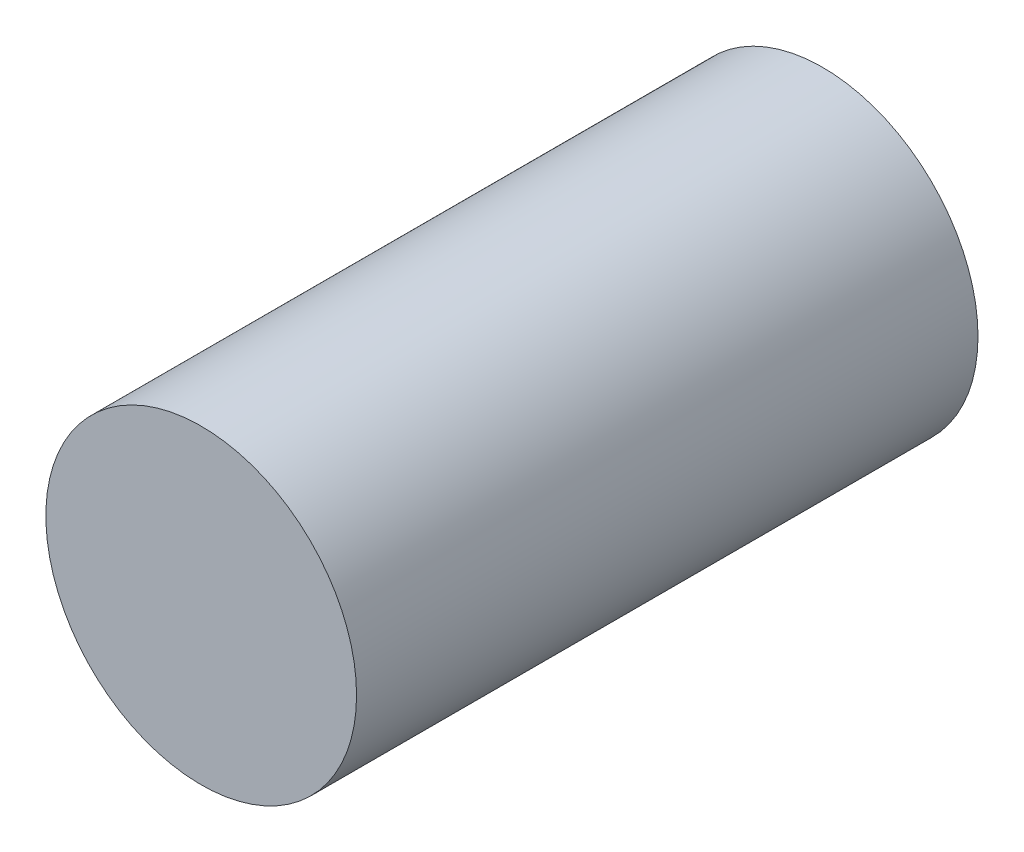
ISO-10303-21;
HEADER;
FILE_DESCRIPTION(('STEP AP214'),'2;1');
FILE_NAME('part.step','',(''),(''),'','','');
FILE_SCHEMA(('AUTOMOTIVE_DESIGN { 1 0 10303 214 1 1 1 1 }'));
ENDSEC;
DATA;
#1=APPLICATION_CONTEXT('core data for automotive mechanical design processes');
#2=APPLICATION_PROTOCOL_DEFINITION('international standard','automotive_design',2000,#1);
#3=PRODUCT_CONTEXT('',#1,'mechanical');
#4=PRODUCT('Part','Part','',(#3));
#5=PRODUCT_RELATED_PRODUCT_CATEGORY('part','',(#4));
#6=PRODUCT_DEFINITION_FORMATION('','',#4);
#7=PRODUCT_DEFINITION_CONTEXT('part definition',#1,'design');
#8=PRODUCT_DEFINITION('design','',#6,#7);
#9=PRODUCT_DEFINITION_SHAPE('','',#8);
#10=(LENGTH_UNIT() NAMED_UNIT(*) SI_UNIT(.MILLI.,.METRE.));
#11=(NAMED_UNIT(*) PLANE_ANGLE_UNIT() SI_UNIT($,.RADIAN.));
#12=(NAMED_UNIT(*) SI_UNIT($,.STERADIAN.) SOLID_ANGLE_UNIT());
#13=UNCERTAINTY_MEASURE_WITH_UNIT(LENGTH_MEASURE(1.E-05),#10,'distance_accuracy_value','');
#14=(GEOMETRIC_REPRESENTATION_CONTEXT(3) GLOBAL_UNCERTAINTY_ASSIGNED_CONTEXT((#13)) GLOBAL_UNIT_ASSIGNED_CONTEXT((#10,
#11,#12)) REPRESENTATION_CONTEXT('',''));
#15=CARTESIAN_POINT('',(0.,0.,0.));
#16=DIRECTION('',(0.,0.,1.));
#17=DIRECTION('',(1.,0.,0.));
#18=AXIS2_PLACEMENT_3D('',#15,#16,#17);
#19=CARTESIAN_POINT('',(0.,0.,-30.));
#20=DIRECTION('',(0.,0.,1.));
#21=DIRECTION('',(1.,0.,0.));
#22=AXIS2_PLACEMENT_3D('',#19,#20,#21);
#23=CYLINDRICAL_SURFACE('',#22,7.5);
#24=CARTESIAN_POINT('',(0.,0.,-30.));
#25=DIRECTION('',(0.,0.,1.));
#26=DIRECTION('',(1.,0.,0.));
#27=AXIS2_PLACEMENT_3D('',#24,#25,#26);
#28=CIRCLE('',#27,7.5);
#29=CARTESIAN_POINT('',(7.5,0.,-30.));
#30=VERTEX_POINT('',#29);
#31=EDGE_CURVE('E10',#30,#30,#28,.T.);
#32=ORIENTED_EDGE('',*,*,#31,.T.);
#33=EDGE_LOOP('',(#32));
#34=FACE_BOUND('',#33,.T.);
#35=CARTESIAN_POINT('',(0.,0.,0.));
#36=DIRECTION('',(0.,0.,1.));
#37=DIRECTION('',(1.,0.,0.));
#38=AXIS2_PLACEMENT_3D('',#35,#36,#37);
#39=CIRCLE('',#38,7.5);
#40=CARTESIAN_POINT('',(7.5,0.,0.));
#41=VERTEX_POINT('',#40);
#42=EDGE_CURVE('E44',#41,#41,#39,.T.);
#43=ORIENTED_EDGE('',*,*,#42,.F.);
#44=EDGE_LOOP('',(#43));
#45=FACE_BOUND('',#44,.T.);
#46=ADVANCED_FACE('F41',(#34,#45),#23,.T.);
#47=CARTESIAN_POINT('',(0.,0.,-30.));
#48=DIRECTION('',(0.,0.,1.));
#49=DIRECTION('',(1.,0.,0.));
#50=AXIS2_PLACEMENT_3D('',#47,#48,#49);
#51=PLANE('',#50);
#52=ORIENTED_EDGE('',*,*,#31,.F.);
#53=EDGE_LOOP('',(#52));
#54=FACE_BOUND('',#53,.T.);
#55=ADVANCED_FACE('F58',(#54),#51,.F.);
#56=CARTESIAN_POINT('',(0.,0.,0.));
#57=DIRECTION('',(0.,0.,1.));
#58=DIRECTION('',(1.,0.,0.));
#59=AXIS2_PLACEMENT_3D('',#56,#57,#58);
#60=PLANE('',#59);
#61=ORIENTED_EDGE('',*,*,#42,.T.);
#62=EDGE_LOOP('',(#61));
#63=FACE_BOUND('',#62,.T.);
#64=ADVANCED_FACE('F55',(#63),#60,.T.);
#65=CLOSED_SHELL('',(#46,#55,#64));
#66=MANIFOLD_SOLID_BREP('B2',#65);
#67=ADVANCED_BREP_SHAPE_REPRESENTATION('',(#18,#66),#14);
#68=SHAPE_DEFINITION_REPRESENTATION(#9,#67);
ENDSEC;
END-ISO-10303-21;
